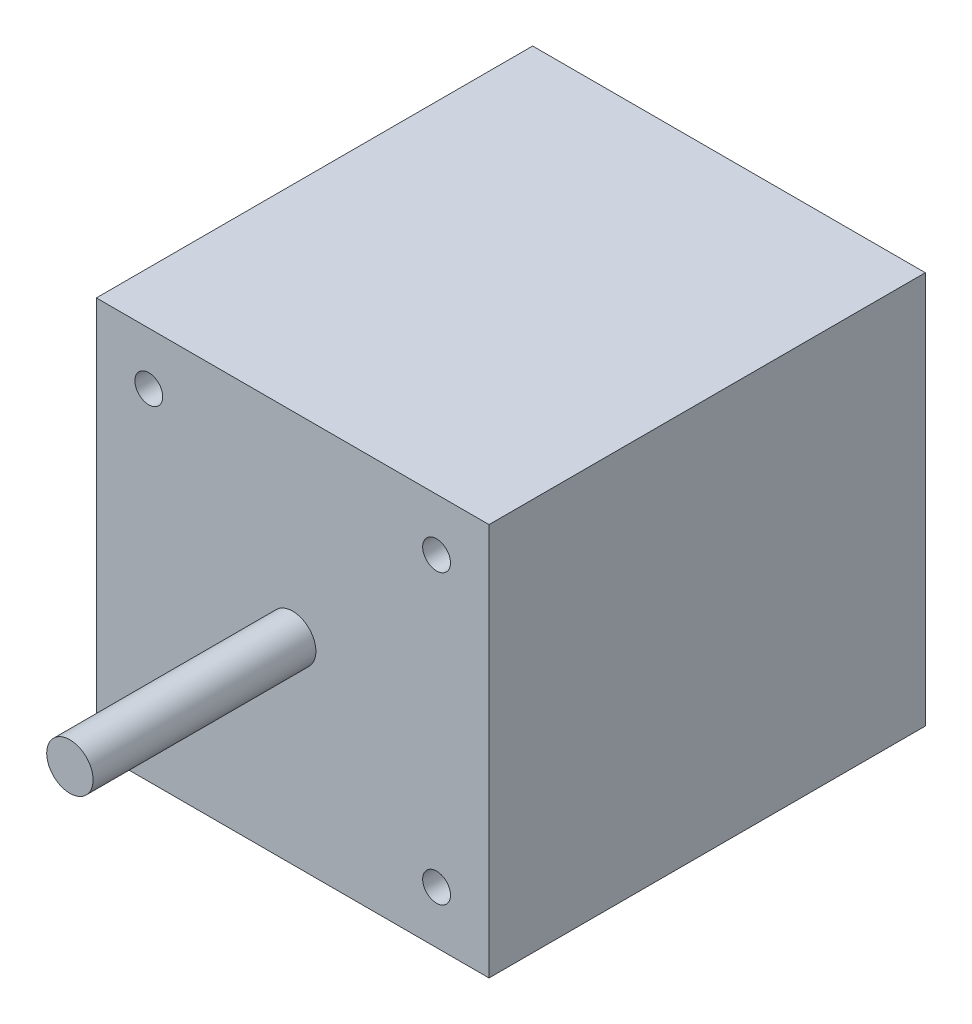
ISO-10303-21;
HEADER;
FILE_DESCRIPTION(('STEP AP214'),'2;1');
FILE_NAME('part.step','',(''),(''),'','','');
FILE_SCHEMA(('AUTOMOTIVE_DESIGN { 1 0 10303 214 1 1 1 1 }'));
ENDSEC;
DATA;
#1=APPLICATION_CONTEXT('core data for automotive mechanical design processes');
#2=APPLICATION_PROTOCOL_DEFINITION('international standard','automotive_design',2000,#1);
#3=PRODUCT_CONTEXT('',#1,'mechanical');
#4=PRODUCT('Part','Part','',(#3));
#5=PRODUCT_RELATED_PRODUCT_CATEGORY('part','',(#4));
#6=PRODUCT_DEFINITION_FORMATION('','',#4);
#7=PRODUCT_DEFINITION_CONTEXT('part definition',#1,'design');
#8=PRODUCT_DEFINITION('design','',#6,#7);
#9=PRODUCT_DEFINITION_SHAPE('','',#8);
#10=(LENGTH_UNIT() NAMED_UNIT(*) SI_UNIT(.MILLI.,.METRE.));
#11=(NAMED_UNIT(*) PLANE_ANGLE_UNIT() SI_UNIT($,.RADIAN.));
#12=(NAMED_UNIT(*) SI_UNIT($,.STERADIAN.) SOLID_ANGLE_UNIT());
#13=UNCERTAINTY_MEASURE_WITH_UNIT(LENGTH_MEASURE(1.E-05),#10,'distance_accuracy_value','');
#14=(GEOMETRIC_REPRESENTATION_CONTEXT(3) GLOBAL_UNCERTAINTY_ASSIGNED_CONTEXT((#13)) GLOBAL_UNIT_ASSIGNED_CONTEXT((#10,
#11,#12)) REPRESENTATION_CONTEXT('',''));
#15=CARTESIAN_POINT('',(0.,0.,0.));
#16=DIRECTION('',(0.,0.,1.));
#17=DIRECTION('',(1.,0.,0.));
#18=AXIS2_PLACEMENT_3D('',#15,#16,#17);
#19=CARTESIAN_POINT('',(0.,0.,47.));
#20=DIRECTION('',(1.,0.,0.));
#21=DIRECTION('',(0.,0.,-1.));
#22=AXIS2_PLACEMENT_3D('',#19,#20,#21);
#23=PLANE('',#22);
#24=DIRECTION('',(0.,-1.,0.));
#25=VECTOR('',#24,1.);
#26=CARTESIAN_POINT('',(0.,0.,0.));
#27=LINE('',#26,#25);
#28=CARTESIAN_POINT('',(0.,42.3,0.));
#29=VERTEX_POINT('',#28);
#30=CARTESIAN_POINT('',(0.,0.,0.));
#31=VERTEX_POINT('',#30);
#32=EDGE_CURVE('E99',#29,#31,#27,.T.);
#33=ORIENTED_EDGE('',*,*,#32,.T.);
#34=DIRECTION('',(0.,0.,-1.));
#35=VECTOR('',#34,1.);
#36=CARTESIAN_POINT('',(0.,0.,47.));
#37=LINE('',#36,#35);
#38=CARTESIAN_POINT('',(0.,0.,47.));
#39=VERTEX_POINT('',#38);
#40=EDGE_CURVE('E41',#39,#31,#37,.T.);
#41=ORIENTED_EDGE('',*,*,#40,.F.);
#42=DIRECTION('',(0.,-1.,0.));
#43=VECTOR('',#42,1.);
#44=CARTESIAN_POINT('',(0.,0.,47.));
#45=LINE('',#44,#43);
#46=CARTESIAN_POINT('',(0.,42.3,47.));
#47=VERTEX_POINT('',#46);
#48=EDGE_CURVE('E85',#47,#39,#45,.T.);
#49=ORIENTED_EDGE('',*,*,#48,.F.);
#50=DIRECTION('',(0.,0.,-1.));
#51=VECTOR('',#50,1.);
#52=CARTESIAN_POINT('',(0.,42.3,47.));
#53=LINE('',#52,#51);
#54=EDGE_CURVE('E95',#47,#29,#53,.T.);
#55=ORIENTED_EDGE('',*,*,#54,.T.);
#56=EDGE_LOOP('',(#33,#41,#49,#55));
#57=FACE_BOUND('',#56,.T.);
#58=ADVANCED_FACE('F33',(#57),#23,.F.);
#59=CARTESIAN_POINT('',(0.,0.,47.));
#60=DIRECTION('',(0.,1.,0.));
#61=DIRECTION('',(0.,0.,1.));
#62=AXIS2_PLACEMENT_3D('',#59,#60,#61);
#63=PLANE('',#62);
#64=DIRECTION('',(1.,0.,0.));
#65=VECTOR('',#64,1.);
#66=CARTESIAN_POINT('',(0.,0.,0.));
#67=LINE('',#66,#65);
#68=CARTESIAN_POINT('',(42.3,0.,0.));
#69=VERTEX_POINT('',#68);
#70=EDGE_CURVE('E90',#31,#69,#67,.T.);
#71=ORIENTED_EDGE('',*,*,#70,.T.);
#72=DIRECTION('',(0.,0.,-1.));
#73=VECTOR('',#72,1.);
#74=CARTESIAN_POINT('',(42.3,0.,47.));
#75=LINE('',#74,#73);
#76=CARTESIAN_POINT('',(42.3,0.,47.));
#77=VERTEX_POINT('',#76);
#78=EDGE_CURVE('E88',#77,#69,#75,.T.);
#79=ORIENTED_EDGE('',*,*,#78,.F.);
#80=DIRECTION('',(1.,0.,0.));
#81=VECTOR('',#80,1.);
#82=CARTESIAN_POINT('',(0.,0.,47.));
#83=LINE('',#82,#81);
#84=EDGE_CURVE('E80',#39,#77,#83,.T.);
#85=ORIENTED_EDGE('',*,*,#84,.F.);
#86=ORIENTED_EDGE('',*,*,#40,.T.);
#87=EDGE_LOOP('',(#71,#79,#85,#86));
#88=FACE_BOUND('',#87,.T.);
#89=ADVANCED_FACE('F89',(#88),#63,.F.);
#90=CARTESIAN_POINT('',(42.3,0.,47.));
#91=DIRECTION('',(-1.,0.,0.));
#92=DIRECTION('',(0.,0.,1.));
#93=AXIS2_PLACEMENT_3D('',#90,#91,#92);
#94=PLANE('',#93);
#95=DIRECTION('',(0.,1.,0.));
#96=VECTOR('',#95,1.);
#97=CARTESIAN_POINT('',(42.3,0.,0.));
#98=LINE('',#97,#96);
#99=CARTESIAN_POINT('',(42.3,42.3,0.));
#100=VERTEX_POINT('',#99);
#101=EDGE_CURVE('E66',#69,#100,#98,.T.);
#102=ORIENTED_EDGE('',*,*,#101,.T.);
#103=DIRECTION('',(0.,0.,-1.));
#104=VECTOR('',#103,1.);
#105=CARTESIAN_POINT('',(42.3,42.3,47.));
#106=LINE('',#105,#104);
#107=CARTESIAN_POINT('',(42.3,42.3,47.));
#108=VERTEX_POINT('',#107);
#109=EDGE_CURVE('E91',#108,#100,#106,.T.);
#110=ORIENTED_EDGE('',*,*,#109,.F.);
#111=DIRECTION('',(0.,1.,0.));
#112=VECTOR('',#111,1.);
#113=CARTESIAN_POINT('',(42.3,0.,47.));
#114=LINE('',#113,#112);
#115=EDGE_CURVE('E83',#77,#108,#114,.T.);
#116=ORIENTED_EDGE('',*,*,#115,.F.);
#117=ORIENTED_EDGE('',*,*,#78,.T.);
#118=EDGE_LOOP('',(#102,#110,#116,#117));
#119=FACE_BOUND('',#118,.T.);
#120=ADVANCED_FACE('F93',(#119),#94,.F.);
#121=CARTESIAN_POINT('',(0.,42.3,47.));
#122=DIRECTION('',(0.,-1.,0.));
#123=DIRECTION('',(0.,0.,-1.));
#124=AXIS2_PLACEMENT_3D('',#121,#122,#123);
#125=PLANE('',#124);
#126=DIRECTION('',(-1.,0.,0.));
#127=VECTOR('',#126,1.);
#128=CARTESIAN_POINT('',(0.,42.3,0.));
#129=LINE('',#128,#127);
#130=EDGE_CURVE('E72',#100,#29,#129,.T.);
#131=ORIENTED_EDGE('',*,*,#130,.T.);
#132=ORIENTED_EDGE('',*,*,#54,.F.);
#133=DIRECTION('',(-1.,0.,0.));
#134=VECTOR('',#133,1.);
#135=CARTESIAN_POINT('',(0.,42.3,47.));
#136=LINE('',#135,#134);
#137=EDGE_CURVE('E49',#108,#47,#136,.T.);
#138=ORIENTED_EDGE('',*,*,#137,.F.);
#139=ORIENTED_EDGE('',*,*,#109,.T.);
#140=EDGE_LOOP('',(#131,#132,#138,#139));
#141=FACE_BOUND('',#140,.T.);
#142=ADVANCED_FACE('F121',(#141),#125,.F.);
#143=CARTESIAN_POINT('',(0.,0.,47.));
#144=DIRECTION('',(0.,0.,-1.));
#145=DIRECTION('',(-1.,0.,0.));
#146=AXIS2_PLACEMENT_3D('',#143,#144,#145);
#147=PLANE('',#146);
#148=CARTESIAN_POINT('',(5.65,5.65,47.));
#149=DIRECTION('',(0.,0.,1.));
#150=DIRECTION('',(1.,0.,0.));
#151=AXIS2_PLACEMENT_3D('',#148,#149,#150);
#152=CIRCLE('',#151,1.5);
#153=CARTESIAN_POINT('',(7.15,5.65,47.));
#154=VERTEX_POINT('',#153);
#155=EDGE_CURVE('E247',#154,#154,#152,.T.);
#156=ORIENTED_EDGE('',*,*,#155,.F.);
#157=EDGE_LOOP('',(#156));
#158=FACE_BOUND('',#157,.T.);
#159=CARTESIAN_POINT('',(36.65,5.65,47.));
#160=DIRECTION('',(0.,0.,1.));
#161=DIRECTION('',(1.,0.,0.));
#162=AXIS2_PLACEMENT_3D('',#159,#160,#161);
#163=CIRCLE('',#162,1.5);
#164=CARTESIAN_POINT('',(38.15,5.65,47.));
#165=VERTEX_POINT('',#164);
#166=EDGE_CURVE('E252',#165,#165,#163,.T.);
#167=ORIENTED_EDGE('',*,*,#166,.F.);
#168=EDGE_LOOP('',(#167));
#169=FACE_BOUND('',#168,.T.);
#170=CARTESIAN_POINT('',(36.65,36.65,47.));
#171=DIRECTION('',(0.,0.,1.));
#172=DIRECTION('',(1.,0.,0.));
#173=AXIS2_PLACEMENT_3D('',#170,#171,#172);
#174=CIRCLE('',#173,1.5);
#175=CARTESIAN_POINT('',(38.15,36.65,47.));
#176=VERTEX_POINT('',#175);
#177=EDGE_CURVE('E258',#176,#176,#174,.T.);
#178=ORIENTED_EDGE('',*,*,#177,.F.);
#179=EDGE_LOOP('',(#178));
#180=FACE_BOUND('',#179,.T.);
#181=CARTESIAN_POINT('',(5.65,36.65,47.));
#182=DIRECTION('',(0.,0.,1.));
#183=DIRECTION('',(1.,0.,0.));
#184=AXIS2_PLACEMENT_3D('',#181,#182,#183);
#185=CIRCLE('',#184,1.5);
#186=CARTESIAN_POINT('',(7.15,36.65,47.));
#187=VERTEX_POINT('',#186);
#188=EDGE_CURVE('E241',#187,#187,#185,.T.);
#189=ORIENTED_EDGE('',*,*,#188,.F.);
#190=EDGE_LOOP('',(#189));
#191=FACE_BOUND('',#190,.T.);
#192=CARTESIAN_POINT('',(21.15,21.15,47.));
#193=DIRECTION('',(0.,0.,-1.));
#194=DIRECTION('',(-1.,0.,0.));
#195=AXIS2_PLACEMENT_3D('',#192,#193,#194);
#196=CIRCLE('',#195,2.5);
#197=CARTESIAN_POINT('',(18.65,21.15,47.));
#198=VERTEX_POINT('',#197);
#199=EDGE_CURVE('E11',#198,#198,#196,.F.);
#200=ORIENTED_EDGE('',*,*,#199,.F.);
#201=EDGE_LOOP('',(#200));
#202=FACE_BOUND('',#201,.T.);
#203=ORIENTED_EDGE('',*,*,#48,.T.);
#204=ORIENTED_EDGE('',*,*,#84,.T.);
#205=ORIENTED_EDGE('',*,*,#115,.T.);
#206=ORIENTED_EDGE('',*,*,#137,.T.);
#207=EDGE_LOOP('',(#203,#204,#205,#206));
#208=FACE_BOUND('',#207,.T.);
#209=ADVANCED_FACE('F81',(#158,#169,#180,#191,#202,#208),#147,.F.);
#210=CARTESIAN_POINT('',(0.,0.,0.));
#211=DIRECTION('',(0.,0.,-1.));
#212=DIRECTION('',(-1.,0.,0.));
#213=AXIS2_PLACEMENT_3D('',#210,#211,#212);
#214=PLANE('',#213);
#215=ORIENTED_EDGE('',*,*,#32,.F.);
#216=ORIENTED_EDGE('',*,*,#130,.F.);
#217=ORIENTED_EDGE('',*,*,#101,.F.);
#218=ORIENTED_EDGE('',*,*,#70,.F.);
#219=EDGE_LOOP('',(#215,#216,#217,#218));
#220=FACE_BOUND('',#219,.T.);
#221=ADVANCED_FACE('F110',(#220),#214,.T.);
#222=CARTESIAN_POINT('',(21.15,21.15,71.));
#223=DIRECTION('',(0.,0.,-1.));
#224=DIRECTION('',(-1.,0.,0.));
#225=AXIS2_PLACEMENT_3D('',#222,#223,#224);
#226=CYLINDRICAL_SURFACE('',#225,2.5);
#227=CARTESIAN_POINT('',(21.15,21.15,71.));
#228=DIRECTION('',(0.,0.,1.));
#229=DIRECTION('',(1.,0.,0.));
#230=AXIS2_PLACEMENT_3D('',#227,#228,#229);
#231=CIRCLE('',#230,2.5);
#232=CARTESIAN_POINT('',(23.65,21.15,71.));
#233=VERTEX_POINT('',#232);
#234=EDGE_CURVE('E102',#233,#233,#231,.T.);
#235=ORIENTED_EDGE('',*,*,#234,.F.);
#236=EDGE_LOOP('',(#235));
#237=FACE_BOUND('',#236,.T.);
#238=ORIENTED_EDGE('',*,*,#199,.T.);
#239=EDGE_LOOP('',(#238));
#240=FACE_BOUND('',#239,.T.);
#241=ADVANCED_FACE('F112',(#237,#240),#226,.T.);
#242=CARTESIAN_POINT('',(21.15,21.15,71.));
#243=DIRECTION('',(0.,0.,1.));
#244=DIRECTION('',(1.,0.,0.));
#245=AXIS2_PLACEMENT_3D('',#242,#243,#244);
#246=PLANE('',#245);
#247=ORIENTED_EDGE('',*,*,#234,.T.);
#248=EDGE_LOOP('',(#247));
#249=FACE_BOUND('',#248,.T.);
#250=ADVANCED_FACE('F118',(#249),#246,.T.);
#251=CARTESIAN_POINT('',(5.65,36.65,42.5));
#252=DIRECTION('',(0.,0.,1.));
#253=DIRECTION('',(1.,0.,0.));
#254=AXIS2_PLACEMENT_3D('',#251,#252,#253);
#255=CYLINDRICAL_SURFACE('',#254,1.5);
#256=CARTESIAN_POINT('',(5.65,36.65,42.5));
#257=DIRECTION('',(0.,0.,1.));
#258=DIRECTION('',(1.,0.,0.));
#259=AXIS2_PLACEMENT_3D('',#256,#257,#258);
#260=CIRCLE('',#259,1.5);
#261=CARTESIAN_POINT('',(7.15,36.65,42.5));
#262=VERTEX_POINT('',#261);
#263=EDGE_CURVE('E238',#262,#262,#260,.T.);
#264=ORIENTED_EDGE('',*,*,#263,.F.);
#265=EDGE_LOOP('',(#264));
#266=FACE_BOUND('',#265,.T.);
#267=ORIENTED_EDGE('',*,*,#188,.T.);
#268=EDGE_LOOP('',(#267));
#269=FACE_BOUND('',#268,.T.);
#270=ADVANCED_FACE('F153',(#266,#269),#255,.F.);
#271=CARTESIAN_POINT('',(5.65,36.65,42.5));
#272=DIRECTION('',(0.,0.,1.));
#273=DIRECTION('',(1.,0.,0.));
#274=AXIS2_PLACEMENT_3D('',#271,#272,#273);
#275=PLANE('',#274);
#276=ORIENTED_EDGE('',*,*,#263,.T.);
#277=EDGE_LOOP('',(#276));
#278=FACE_BOUND('',#277,.T.);
#279=ADVANCED_FACE('F158',(#278),#275,.T.);
#280=CARTESIAN_POINT('',(36.65,36.65,42.5));
#281=DIRECTION('',(0.,0.,1.));
#282=DIRECTION('',(1.,0.,0.));
#283=AXIS2_PLACEMENT_3D('',#280,#281,#282);
#284=CYLINDRICAL_SURFACE('',#283,1.5);
#285=CARTESIAN_POINT('',(36.65,36.65,42.5));
#286=DIRECTION('',(0.,0.,1.));
#287=DIRECTION('',(1.,0.,0.));
#288=AXIS2_PLACEMENT_3D('',#285,#286,#287);
#289=CIRCLE('',#288,1.5);
#290=CARTESIAN_POINT('',(38.15,36.65,42.5));
#291=VERTEX_POINT('',#290);
#292=EDGE_CURVE('E245',#291,#291,#289,.T.);
#293=ORIENTED_EDGE('',*,*,#292,.F.);
#294=EDGE_LOOP('',(#293));
#295=FACE_BOUND('',#294,.T.);
#296=ORIENTED_EDGE('',*,*,#177,.T.);
#297=EDGE_LOOP('',(#296));
#298=FACE_BOUND('',#297,.T.);
#299=ADVANCED_FACE('F168',(#295,#298),#284,.F.);
#300=CARTESIAN_POINT('',(36.65,36.65,42.5));
#301=DIRECTION('',(0.,0.,1.));
#302=DIRECTION('',(1.,0.,0.));
#303=AXIS2_PLACEMENT_3D('',#300,#301,#302);
#304=PLANE('',#303);
#305=ORIENTED_EDGE('',*,*,#292,.T.);
#306=EDGE_LOOP('',(#305));
#307=FACE_BOUND('',#306,.T.);
#308=ADVANCED_FACE('F178',(#307),#304,.T.);
#309=CARTESIAN_POINT('',(36.65,5.65,42.5));
#310=DIRECTION('',(0.,0.,1.));
#311=DIRECTION('',(1.,0.,0.));
#312=AXIS2_PLACEMENT_3D('',#309,#310,#311);
#313=CYLINDRICAL_SURFACE('',#312,1.5);
#314=CARTESIAN_POINT('',(36.65,5.65,42.5));
#315=DIRECTION('',(0.,0.,1.));
#316=DIRECTION('',(1.,0.,0.));
#317=AXIS2_PLACEMENT_3D('',#314,#315,#316);
#318=CIRCLE('',#317,1.5);
#319=CARTESIAN_POINT('',(38.15,5.65,42.5));
#320=VERTEX_POINT('',#319);
#321=EDGE_CURVE('E255',#320,#320,#318,.T.);
#322=ORIENTED_EDGE('',*,*,#321,.F.);
#323=EDGE_LOOP('',(#322));
#324=FACE_BOUND('',#323,.T.);
#325=ORIENTED_EDGE('',*,*,#166,.T.);
#326=EDGE_LOOP('',(#325));
#327=FACE_BOUND('',#326,.T.);
#328=ADVANCED_FACE('F188',(#324,#327),#313,.F.);
#329=CARTESIAN_POINT('',(36.65,5.65,42.5));
#330=DIRECTION('',(0.,0.,1.));
#331=DIRECTION('',(1.,0.,0.));
#332=AXIS2_PLACEMENT_3D('',#329,#330,#331);
#333=PLANE('',#332);
#334=ORIENTED_EDGE('',*,*,#321,.T.);
#335=EDGE_LOOP('',(#334));
#336=FACE_BOUND('',#335,.T.);
#337=ADVANCED_FACE('F198',(#336),#333,.T.);
#338=CARTESIAN_POINT('',(5.65,5.65,42.5));
#339=DIRECTION('',(0.,0.,1.));
#340=DIRECTION('',(1.,0.,0.));
#341=AXIS2_PLACEMENT_3D('',#338,#339,#340);
#342=CYLINDRICAL_SURFACE('',#341,1.5);
#343=CARTESIAN_POINT('',(5.65,5.65,42.5));
#344=DIRECTION('',(0.,0.,1.));
#345=DIRECTION('',(1.,0.,0.));
#346=AXIS2_PLACEMENT_3D('',#343,#344,#345);
#347=CIRCLE('',#346,1.5);
#348=CARTESIAN_POINT('',(7.15,5.65,42.5));
#349=VERTEX_POINT('',#348);
#350=EDGE_CURVE('E250',#349,#349,#347,.T.);
#351=ORIENTED_EDGE('',*,*,#350,.F.);
#352=EDGE_LOOP('',(#351));
#353=FACE_BOUND('',#352,.T.);
#354=ORIENTED_EDGE('',*,*,#155,.T.);
#355=EDGE_LOOP('',(#354));
#356=FACE_BOUND('',#355,.T.);
#357=ADVANCED_FACE('F208',(#353,#356),#342,.F.);
#358=CARTESIAN_POINT('',(5.65,5.65,42.5));
#359=DIRECTION('',(0.,0.,1.));
#360=DIRECTION('',(1.,0.,0.));
#361=AXIS2_PLACEMENT_3D('',#358,#359,#360);
#362=PLANE('',#361);
#363=ORIENTED_EDGE('',*,*,#350,.T.);
#364=EDGE_LOOP('',(#363));
#365=FACE_BOUND('',#364,.T.);
#366=ADVANCED_FACE('F218',(#365),#362,.T.);
#367=CLOSED_SHELL('',(#58,#89,#120,#142,#209,#221,#241,#250,#270,#279,#299,#308,#328,#337,#357,#366));
#368=MANIFOLD_SOLID_BREP('B2',#367);
#369=ADVANCED_BREP_SHAPE_REPRESENTATION('',(#18,#368),#14);
#370=SHAPE_DEFINITION_REPRESENTATION(#9,#369);
ENDSEC;
END-ISO-10303-21;
